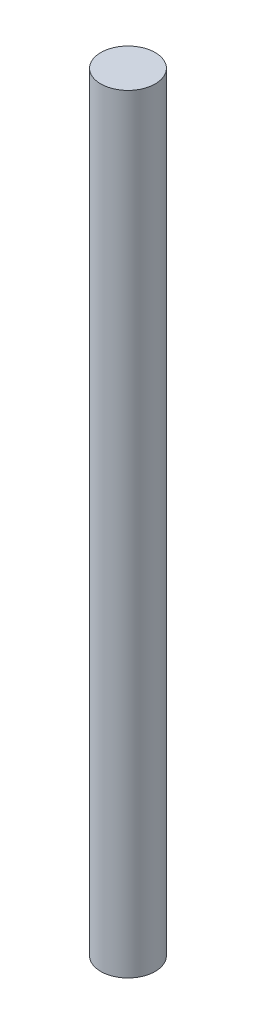
ISO-10303-21;
HEADER;
FILE_DESCRIPTION(('STEP AP214'),'2;1');
FILE_NAME('part.step','',(''),(''),'','','');
FILE_SCHEMA(('AUTOMOTIVE_DESIGN { 1 0 10303 214 1 1 1 1 }'));
ENDSEC;
DATA;
#1=APPLICATION_CONTEXT('core data for automotive mechanical design processes');
#2=APPLICATION_PROTOCOL_DEFINITION('international standard','automotive_design',2000,#1);
#3=PRODUCT_CONTEXT('',#1,'mechanical');
#4=PRODUCT('Part','Part','',(#3));
#5=PRODUCT_RELATED_PRODUCT_CATEGORY('part','',(#4));
#6=PRODUCT_DEFINITION_FORMATION('','',#4);
#7=PRODUCT_DEFINITION_CONTEXT('part definition',#1,'design');
#8=PRODUCT_DEFINITION('design','',#6,#7);
#9=PRODUCT_DEFINITION_SHAPE('','',#8);
#10=(LENGTH_UNIT() NAMED_UNIT(*) SI_UNIT(.MILLI.,.METRE.));
#11=(NAMED_UNIT(*) PLANE_ANGLE_UNIT() SI_UNIT($,.RADIAN.));
#12=(NAMED_UNIT(*) SI_UNIT($,.STERADIAN.) SOLID_ANGLE_UNIT());
#13=UNCERTAINTY_MEASURE_WITH_UNIT(LENGTH_MEASURE(1.E-05),#10,'distance_accuracy_value','');
#14=(GEOMETRIC_REPRESENTATION_CONTEXT(3) GLOBAL_UNCERTAINTY_ASSIGNED_CONTEXT((#13)) GLOBAL_UNIT_ASSIGNED_CONTEXT((#10,
#11,#12)) REPRESENTATION_CONTEXT('',''));
#15=CARTESIAN_POINT('',(0.,0.,0.));
#16=DIRECTION('',(0.,0.,1.));
#17=DIRECTION('',(1.,0.,0.));
#18=AXIS2_PLACEMENT_3D('',#15,#16,#17);
#19=CARTESIAN_POINT('',(0.,113.,0.));
#20=DIRECTION('',(0.,-1.,0.));
#21=DIRECTION('',(0.,0.,-1.));
#22=AXIS2_PLACEMENT_3D('',#19,#20,#21);
#23=CYLINDRICAL_SURFACE('',#22,4.);
#24=CARTESIAN_POINT('',(0.,113.,0.));
#25=DIRECTION('',(0.,1.,0.));
#26=DIRECTION('',(0.,0.,1.));
#27=AXIS2_PLACEMENT_3D('',#24,#25,#26);
#28=CIRCLE('',#27,4.);
#29=CARTESIAN_POINT('',(0.,113.,4.));
#30=VERTEX_POINT('',#29);
#31=EDGE_CURVE('E10',#30,#30,#28,.T.);
#32=ORIENTED_EDGE('',*,*,#31,.F.);
#33=EDGE_LOOP('',(#32));
#34=FACE_BOUND('',#33,.T.);
#35=CARTESIAN_POINT('',(0.,0.,0.));
#36=DIRECTION('',(0.,1.,0.));
#37=DIRECTION('',(0.,0.,1.));
#38=AXIS2_PLACEMENT_3D('',#35,#36,#37);
#39=CIRCLE('',#38,4.);
#40=CARTESIAN_POINT('',(0.,0.,4.));
#41=VERTEX_POINT('',#40);
#42=EDGE_CURVE('E52',#41,#41,#39,.T.);
#43=ORIENTED_EDGE('',*,*,#42,.T.);
#44=EDGE_LOOP('',(#43));
#45=FACE_BOUND('',#44,.T.);
#46=ADVANCED_FACE('F49',(#34,#45),#23,.T.);
#47=CARTESIAN_POINT('',(0.,113.,0.));
#48=DIRECTION('',(0.,1.,0.));
#49=DIRECTION('',(0.,0.,1.));
#50=AXIS2_PLACEMENT_3D('',#47,#48,#49);
#51=PLANE('',#50);
#52=ORIENTED_EDGE('',*,*,#31,.T.);
#53=EDGE_LOOP('',(#52));
#54=FACE_BOUND('',#53,.T.);
#55=ADVANCED_FACE('F66',(#54),#51,.T.);
#56=CARTESIAN_POINT('',(0.,0.,0.));
#57=DIRECTION('',(0.,1.,0.));
#58=DIRECTION('',(0.,0.,1.));
#59=AXIS2_PLACEMENT_3D('',#56,#57,#58);
#60=PLANE('',#59);
#61=ORIENTED_EDGE('',*,*,#42,.F.);
#62=EDGE_LOOP('',(#61));
#63=FACE_BOUND('',#62,.T.);
#64=ADVANCED_FACE('F64',(#63),#60,.F.);
#65=CLOSED_SHELL('',(#46,#55,#64));
#66=MANIFOLD_SOLID_BREP('B2',#65);
#67=ADVANCED_BREP_SHAPE_REPRESENTATION('',(#18,#66),#14);
#68=SHAPE_DEFINITION_REPRESENTATION(#9,#67);
ENDSEC;
END-ISO-10303-21;
